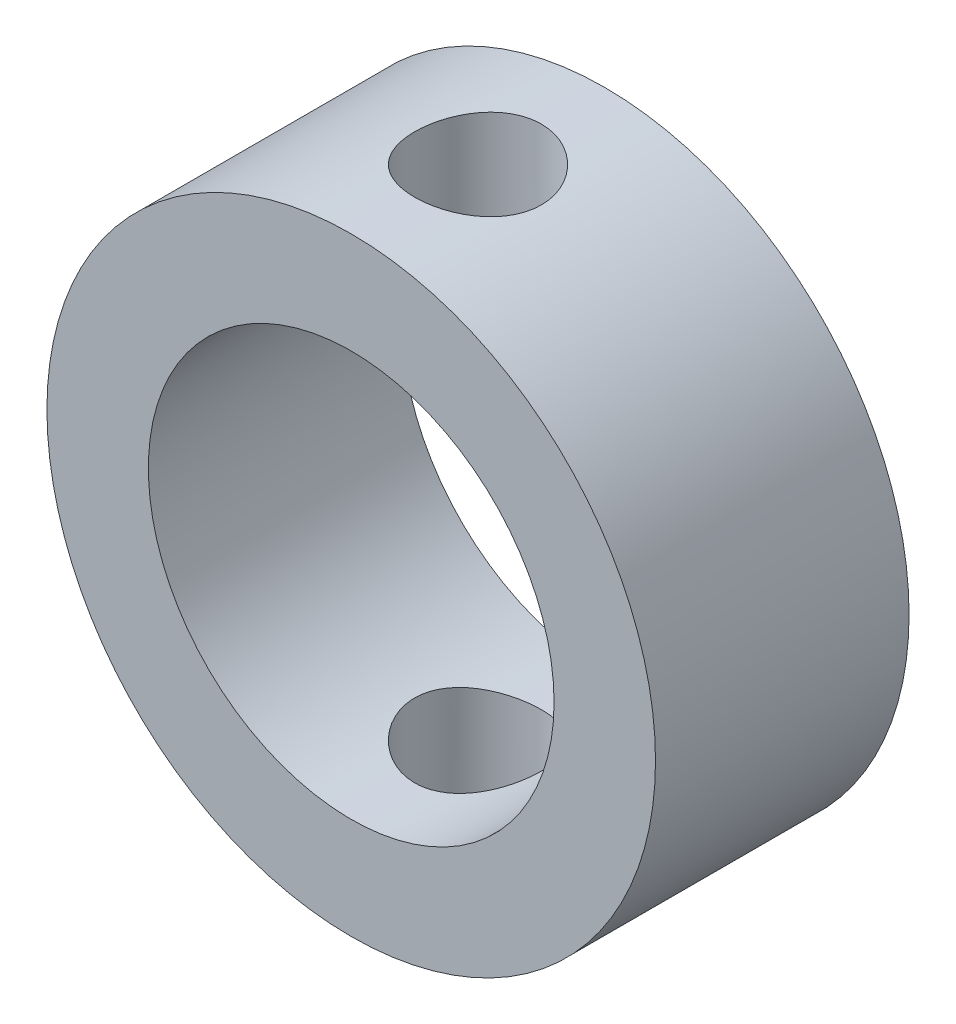
ISO-10303-21;
HEADER;
FILE_DESCRIPTION(('STEP AP214'),'2;1');
FILE_NAME('part.step','',(''),(''),'','','');
FILE_SCHEMA(('AUTOMOTIVE_DESIGN { 1 0 10303 214 1 1 1 1 }'));
ENDSEC;
DATA;
#1=APPLICATION_CONTEXT('core data for automotive mechanical design processes');
#2=APPLICATION_PROTOCOL_DEFINITION('international standard','automotive_design',2000,#1);
#3=PRODUCT_CONTEXT('',#1,'mechanical');
#4=PRODUCT('Part','Part','',(#3));
#5=PRODUCT_RELATED_PRODUCT_CATEGORY('part','',(#4));
#6=PRODUCT_DEFINITION_FORMATION('','',#4);
#7=PRODUCT_DEFINITION_CONTEXT('part definition',#1,'design');
#8=PRODUCT_DEFINITION('design','',#6,#7);
#9=PRODUCT_DEFINITION_SHAPE('','',#8);
#10=(LENGTH_UNIT() NAMED_UNIT(*) SI_UNIT(.MILLI.,.METRE.));
#11=(NAMED_UNIT(*) PLANE_ANGLE_UNIT() SI_UNIT($,.RADIAN.));
#12=(NAMED_UNIT(*) SI_UNIT($,.STERADIAN.) SOLID_ANGLE_UNIT());
#13=UNCERTAINTY_MEASURE_WITH_UNIT(LENGTH_MEASURE(1.E-05),#10,'distance_accuracy_value','');
#14=(GEOMETRIC_REPRESENTATION_CONTEXT(3) GLOBAL_UNCERTAINTY_ASSIGNED_CONTEXT((#13)) GLOBAL_UNIT_ASSIGNED_CONTEXT((#10,
#11,#12)) REPRESENTATION_CONTEXT('',''));
#15=CARTESIAN_POINT('',(0.,0.,0.));
#16=DIRECTION('',(0.,0.,1.));
#17=DIRECTION('',(1.,0.,0.));
#18=AXIS2_PLACEMENT_3D('',#15,#16,#17);
#19=CARTESIAN_POINT('',(0.,0.,5.));
#20=DIRECTION('',(0.,0.,-1.));
#21=DIRECTION('',(-1.,0.,0.));
#22=AXIS2_PLACEMENT_3D('',#19,#20,#21);
#23=CYLINDRICAL_SURFACE('',#22,6.);
#24=CARTESIAN_POINT('',(0.,-6.,3.75));
#25=CARTESIAN_POINT('',(-0.0694090417016604,-5.99999871526651,3.74999752253078));
#26=CARTESIAN_POINT('',(-0.138848789520875,-5.99878328775043,3.74419933428125));
#27=CARTESIAN_POINT('',(-0.275761316266993,-5.9940520099068,3.72118065046715));
#28=CARTESIAN_POINT('',(-0.343232560128313,-5.99053441189248,3.70395147696307));
#29=CARTESIAN_POINT('',(-0.474209132291342,-5.98159109196202,3.65862954507818));
#30=CARTESIAN_POINT('',(-0.537718336709185,-5.97616727052645,3.63054760400111));
#31=CARTESIAN_POINT('',(-0.659120328605959,-5.96399927809859,3.56435039114382));
#32=CARTESIAN_POINT('',(-0.717013367534327,-5.95725516625975,3.52623556884417));
#33=CARTESIAN_POINT('',(-0.826390324308837,-5.9430770002465,3.44046365980936));
#34=CARTESIAN_POINT('',(-0.877780244162686,-5.93563505848531,3.39268799876492));
#35=CARTESIAN_POINT('',(-0.971877776769393,-5.92095657692448,3.28920534080489));
#36=CARTESIAN_POINT('',(-1.01458467096099,-5.91372005416683,3.23349768812774));
#37=CARTESIAN_POINT('',(-1.09051031677217,-5.90019442595308,3.11504803123384));
#38=CARTESIAN_POINT('',(-1.12363054680651,-5.89391545174828,3.05224161549726));
#39=CARTESIAN_POINT('',(-1.17881119348064,-5.8831284065002,2.92180254822724));
#40=CARTESIAN_POINT('',(-1.20087280167641,-5.87862014467568,2.85417041755746));
#41=CARTESIAN_POINT('',(-1.23300240133737,-5.87196500986122,2.71701476258436));
#42=CARTESIAN_POINT('',(-1.24323597696799,-5.86978556855865,2.64753164066523));
#43=CARTESIAN_POINT('',(-1.25193357655615,-5.86793690716491,2.50780315713737));
#44=CARTESIAN_POINT('',(-1.25039890894687,-5.86826740800981,2.4375578811347));
#45=CARTESIAN_POINT('',(-1.23573719037197,-5.87137174319175,2.29951897202482));
#46=CARTESIAN_POINT('',(-1.2228010523272,-5.87410533679901,2.23170402033879));
#47=CARTESIAN_POINT('',(-1.18600543529945,-5.88164437615942,2.09922849035507));
#48=CARTESIAN_POINT('',(-1.16214539481382,-5.88644992841317,2.03456807439367));
#49=CARTESIAN_POINT('',(-1.10400003213928,-5.89763191464102,1.90969277158402));
#50=CARTESIAN_POINT('',(-1.06964002534237,-5.90401953785586,1.84951370347293));
#51=CARTESIAN_POINT('',(-0.991522699274818,-5.91763890010721,1.73570425573184));
#52=CARTESIAN_POINT('',(-0.947764212262588,-5.92487074398537,1.68207469116402));
#53=CARTESIAN_POINT('',(-0.851074921546783,-5.93953730929909,1.58178603891963));
#54=CARTESIAN_POINT('',(-0.797981433412083,-5.94697323199473,1.53528383110299));
#55=CARTESIAN_POINT('',(-0.684667288611798,-5.96108088143001,1.45181955777103));
#56=CARTESIAN_POINT('',(-0.624446525025766,-5.96775259670236,1.4148576354016));
#57=CARTESIAN_POINT('',(-0.498405541235478,-5.97959870942815,1.35148991846405));
#58=CARTESIAN_POINT('',(-0.4325754619265,-5.98477039710258,1.32510319543288));
#59=CARTESIAN_POINT('',(-0.297284620972155,-5.99301338211281,1.28380829516451));
#60=CARTESIAN_POINT('',(-0.227824338595089,-5.99608495596053,1.2688986067686));
#61=CARTESIAN_POINT('',(-0.0885918657008345,-5.99974275215456,1.25120574793211));
#62=CARTESIAN_POINT('',(-0.0188480555261778,-6.00037293537579,1.24820805850575));
#63=CARTESIAN_POINT('',(0.120143798757715,-5.99919952252774,1.2538449499691));
#64=CARTESIAN_POINT('',(0.189391872962259,-5.99739607548153,1.2624788186016));
#65=CARTESIAN_POINT('',(0.324726367119814,-5.99158564979184,1.29095565346953));
#66=CARTESIAN_POINT('',(0.390837192894207,-5.98760052868077,1.31068748538347));
#67=CARTESIAN_POINT('',(0.518811446661332,-5.97787227242395,1.36067786042141));
#68=CARTESIAN_POINT('',(0.580674536336776,-5.97212899744579,1.39093724086598));
#69=CARTESIAN_POINT('',(0.699294306943495,-5.95941241490714,1.46158037823756));
#70=CARTESIAN_POINT('',(0.755973219469835,-5.9524239381233,1.50209192956906));
#71=CARTESIAN_POINT('',(0.861805445886521,-5.93802568299709,1.59191956307627));
#72=CARTESIAN_POINT('',(0.910957877913287,-5.93061585542511,1.64123667551894));
#73=CARTESIAN_POINT('',(1.0011786486518,-5.91606024531377,1.7482555769997));
#74=CARTESIAN_POINT('',(1.04209914600205,-5.90892089307501,1.80608303195528));
#75=CARTESIAN_POINT('',(1.11364719079244,-5.89585601015805,1.92791628421379));
#76=CARTESIAN_POINT('',(1.14427516677864,-5.88993042894651,1.9919218241391));
#77=CARTESIAN_POINT('',(1.19417246443922,-5.88001700708041,2.12396119629823));
#78=CARTESIAN_POINT('',(1.21350309828032,-5.87601872784687,2.19197103716584));
#79=CARTESIAN_POINT('',(1.24044038523407,-5.87039184709697,2.33036655049226));
#80=CARTESIAN_POINT('',(1.24804871544441,-5.86876290660367,2.40075188161944));
#81=CARTESIAN_POINT('',(1.25125926487611,-5.86807907308506,2.54041340099965));
#82=CARTESIAN_POINT('',(1.24709542622726,-5.86897402321502,2.60968407022205));
#83=CARTESIAN_POINT('',(1.22739905314032,-5.87312447254927,2.74651400892022));
#84=CARTESIAN_POINT('',(1.21186662782266,-5.87637994909626,2.81407329481611));
#85=CARTESIAN_POINT('',(1.16998217768585,-5.88486132447716,2.94539777189066));
#86=CARTESIAN_POINT('',(1.14366117568421,-5.8900815700793,3.00917324648693));
#87=CARTESIAN_POINT('',(1.08097457299757,-5.90190705738738,3.13143877602667));
#88=CARTESIAN_POINT('',(1.0446080398303,-5.9085124276546,3.18992833963313));
#89=CARTESIAN_POINT('',(0.962073695342411,-5.92251579551146,3.30112162707945));
#90=CARTESIAN_POINT('',(0.915737890418226,-5.92992613868404,3.35369912456499));
#91=CARTESIAN_POINT('',(0.814924438115334,-5.94461839583213,3.45040949322636));
#92=CARTESIAN_POINT('',(0.760444918832968,-5.9519002798488,3.49454041755149));
#93=CARTESIAN_POINT('',(0.644134427507703,-5.96561444547638,3.57358857318406));
#94=CARTESIAN_POINT('',(0.582225921521348,-5.97203596073244,3.60839367988629));
#95=CARTESIAN_POINT('',(0.453319843998454,-5.98319908494092,3.66705022843002));
#96=CARTESIAN_POINT('',(0.386326781907244,-5.98794216182101,3.69091124718188));
#97=CARTESIAN_POINT('',(0.266015292900105,-5.99432499781444,3.72254027828842));
#98=CARTESIAN_POINT('',(0.213367593727929,-5.99644035661395,3.73281876320886));
#99=CARTESIAN_POINT('',(0.107152674176537,-5.99927832789758,3.74654945427733));
#100=CARTESIAN_POINT('',(0.053585487848872,-6.00000099184586,3.75000191266719));
#101=CARTESIAN_POINT('',(0.,-6.,3.75));
#102=B_SPLINE_CURVE_WITH_KNOTS('',3,(#24,#25,#26,#27,#28,#29,#30,#31,#32,#33,#34,#35,#36,#37,
#38,#39,#40,#41,#42,#43,#44,#45,#46,#47,#48,#49,#50,#51,#52,#53,#54,#55,#56,#57,#58,#59,#60,#61,
#62,#63,#64,#65,#66,#67,#68,#69,#70,#71,#72,#73,#74,#75,#76,#77,#78,#79,#80,#81,#82,#83,#84,#85,
#86,#87,#88,#89,#90,#91,#92,#93,#94,#95,#96,#97,#98,#99,#100,#101),.UNSPECIFIED.,.T.,.F.,(4,2,2,
2,2,2,2,2,2,2,2,2,2,2,2,2,2,2,2,2,2,2,2,2,2,2,2,2,2,2,2,2,2,2,2,2,2,2,4),(0.,0.208031045103183,
0.416220199906225,0.624202378825443,0.83217524157299,1.04287526388123,1.25359271551786,
1.46640449178549,1.6791933328549,1.88896575169855,2.09871484767165,2.3050171212906,
2.5113300003028,2.71914592416749,2.92698768368035,3.13889526355466,3.35080602278218,
3.56309724499663,3.77536051045772,3.98378339407676,4.19219351552278,4.39855286632622,
4.60492863390934,4.81401583995737,5.02312752564574,5.23571263829337,5.4482888985131,
5.65970050095026,5.87108185414185,6.07829223291039,6.28550062281362,6.49211731393256,
6.69875319081481,6.9091902483031,7.1196757511737,7.33258864398257,7.54531486464974,
7.70592588477281,7.86653096973392),.UNSPECIFIED.);
#103=CARTESIAN_POINT('',(0.,-6.,3.75));
#104=VERTEX_POINT('',#103);
#105=EDGE_CURVE('E51',#104,#104,#102,.T.);
#106=ORIENTED_EDGE('',*,*,#105,.F.);
#107=EDGE_LOOP('',(#106));
#108=FACE_BOUND('',#107,.T.);
#109=CARTESIAN_POINT('',(0.,0.,5.));
#110=DIRECTION('',(0.,0.,1.));
#111=DIRECTION('',(1.,0.,0.));
#112=AXIS2_PLACEMENT_3D('',#109,#110,#111);
#113=CIRCLE('',#112,6.);
#114=CARTESIAN_POINT('',(6.,0.,5.));
#115=VERTEX_POINT('',#114);
#116=EDGE_CURVE('E10',#115,#115,#113,.T.);
#117=ORIENTED_EDGE('',*,*,#116,.F.);
#118=EDGE_LOOP('',(#117));
#119=FACE_BOUND('',#118,.T.);
#120=CARTESIAN_POINT('',(0.,0.,0.));
#121=DIRECTION('',(0.,0.,1.));
#122=DIRECTION('',(1.,0.,0.));
#123=AXIS2_PLACEMENT_3D('',#120,#121,#122);
#124=CIRCLE('',#123,6.);
#125=CARTESIAN_POINT('',(6.,0.,0.));
#126=VERTEX_POINT('',#125);
#127=EDGE_CURVE('E36',#126,#126,#124,.T.);
#128=ORIENTED_EDGE('',*,*,#127,.T.);
#129=EDGE_LOOP('',(#128));
#130=FACE_BOUND('',#129,.T.);
#131=CARTESIAN_POINT('',(0.,6.,1.25));
#132=CARTESIAN_POINT('',(0.069409041701661,5.99999871526651,1.25000247746922));
#133=CARTESIAN_POINT('',(0.138848789520876,5.99878328775043,1.25580066571875));
#134=CARTESIAN_POINT('',(0.275761316266994,5.9940520099068,1.27881934953285));
#135=CARTESIAN_POINT('',(0.343232560128313,5.99053441189248,1.29604852303693));
#136=CARTESIAN_POINT('',(0.474209132291343,5.98159109196202,1.34137045492182));
#137=CARTESIAN_POINT('',(0.537718336709186,5.97616727052645,1.36945239599888));
#138=CARTESIAN_POINT('',(0.659120328605959,5.96399927809859,1.43564960885618));
#139=CARTESIAN_POINT('',(0.717013367534328,5.95725516625975,1.47376443115583));
#140=CARTESIAN_POINT('',(0.826390324308838,5.9430770002465,1.55953634019064));
#141=CARTESIAN_POINT('',(0.877780244162686,5.93563505848531,1.60731200123508));
#142=CARTESIAN_POINT('',(0.971877776769393,5.92095657692448,1.71079465919511));
#143=CARTESIAN_POINT('',(1.01458467096099,5.91372005416683,1.76650231187226));
#144=CARTESIAN_POINT('',(1.09051031677217,5.90019442595308,1.88495196876616));
#145=CARTESIAN_POINT('',(1.12363054680651,5.89391545174828,1.94775838450274));
#146=CARTESIAN_POINT('',(1.17881119348064,5.8831284065002,2.07819745177275));
#147=CARTESIAN_POINT('',(1.20087280167641,5.87862014467568,2.14582958244254));
#148=CARTESIAN_POINT('',(1.23300240133737,5.87196500986122,2.28298523741564));
#149=CARTESIAN_POINT('',(1.24323597696799,5.86978556855865,2.35246835933477));
#150=CARTESIAN_POINT('',(1.25193357655615,5.86793690716491,2.49219684286263));
#151=CARTESIAN_POINT('',(1.25039890894687,5.86826740800981,2.5624421188653));
#152=CARTESIAN_POINT('',(1.23573719037197,5.87137174319175,2.70048102797518));
#153=CARTESIAN_POINT('',(1.2228010523272,5.87410533679901,2.76829597966121));
#154=CARTESIAN_POINT('',(1.18600543529945,5.88164437615942,2.90077150964493));
#155=CARTESIAN_POINT('',(1.16214539481382,5.88644992841317,2.96543192560633));
#156=CARTESIAN_POINT('',(1.10400003213928,5.89763191464102,3.09030722841598));
#157=CARTESIAN_POINT('',(1.06964002534237,5.90401953785586,3.15048629652707));
#158=CARTESIAN_POINT('',(0.991522699274819,5.91763890010721,3.26429574426816));
#159=CARTESIAN_POINT('',(0.947764212262589,5.92487074398537,3.31792530883598));
#160=CARTESIAN_POINT('',(0.851074921546784,5.93953730929909,3.41821396108037));
#161=CARTESIAN_POINT('',(0.797981433412084,5.94697323199473,3.46471616889701));
#162=CARTESIAN_POINT('',(0.684667288611799,5.96108088143001,3.54818044222897));
#163=CARTESIAN_POINT('',(0.624446525025766,5.96775259670236,3.5851423645984));
#164=CARTESIAN_POINT('',(0.498405541235479,5.97959870942815,3.64851008153595));
#165=CARTESIAN_POINT('',(0.432575461926501,5.98477039710258,3.67489680456712));
#166=CARTESIAN_POINT('',(0.297284620972156,5.99301338211281,3.71619170483549));
#167=CARTESIAN_POINT('',(0.22782433859509,5.99608495596053,3.7311013932314));
#168=CARTESIAN_POINT('',(0.0885918657008356,5.99974275215456,3.74879425206789));
#169=CARTESIAN_POINT('',(0.0188480555261789,6.00037293537579,3.75179194149425));
#170=CARTESIAN_POINT('',(-0.120143798757714,5.99919952252774,3.7461550500309));
#171=CARTESIAN_POINT('',(-0.189391872962258,5.99739607548153,3.7375211813984));
#172=CARTESIAN_POINT('',(-0.324726367119813,5.99158564979184,3.70904434653047));
#173=CARTESIAN_POINT('',(-0.390837192894205,5.98760052868077,3.68931251461653));
#174=CARTESIAN_POINT('',(-0.518811446661331,5.97787227242395,3.63932213957859));
#175=CARTESIAN_POINT('',(-0.580674536336775,5.97212899744579,3.60906275913402));
#176=CARTESIAN_POINT('',(-0.699294306943494,5.95941241490714,3.53841962176244));
#177=CARTESIAN_POINT('',(-0.755973219469834,5.9524239381233,3.49790807043094));
#178=CARTESIAN_POINT('',(-0.86180544588652,5.93802568299709,3.40808043692373));
#179=CARTESIAN_POINT('',(-0.910957877913286,5.93061585542511,3.35876332448106));
#180=CARTESIAN_POINT('',(-1.0011786486518,5.91606024531377,3.2517444230003));
#181=CARTESIAN_POINT('',(-1.04209914600204,5.90892089307501,3.19391696804472));
#182=CARTESIAN_POINT('',(-1.11364719079243,5.89585601015805,3.07208371578621));
#183=CARTESIAN_POINT('',(-1.14427516677864,5.88993042894651,3.00807817586089));
#184=CARTESIAN_POINT('',(-1.19417246443922,5.88001700708041,2.87603880370177));
#185=CARTESIAN_POINT('',(-1.21350309828032,5.87601872784687,2.80802896283416));
#186=CARTESIAN_POINT('',(-1.24044038523407,5.87039184709697,2.66963344950774));
#187=CARTESIAN_POINT('',(-1.24804871544441,5.86876290660367,2.59924811838056));
#188=CARTESIAN_POINT('',(-1.25125926487611,5.86807907308506,2.45958659900035));
#189=CARTESIAN_POINT('',(-1.24709542622725,5.86897402321502,2.39031592977794));
#190=CARTESIAN_POINT('',(-1.22739905314032,5.87312447254927,2.25348599107978));
#191=CARTESIAN_POINT('',(-1.21186662782266,5.87637994909626,2.18592670518389));
#192=CARTESIAN_POINT('',(-1.16998217768585,5.88486132447716,2.05460222810934));
#193=CARTESIAN_POINT('',(-1.14366117568421,5.8900815700793,1.99082675351307));
#194=CARTESIAN_POINT('',(-1.08097457299757,5.90190705738738,1.86856122397333));
#195=CARTESIAN_POINT('',(-1.0446080398303,5.9085124276546,1.81007166036687));
#196=CARTESIAN_POINT('',(-0.962073695342411,5.92251579551146,1.69887837292055));
#197=CARTESIAN_POINT('',(-0.915737890418226,5.92992613868404,1.64630087543501));
#198=CARTESIAN_POINT('',(-0.814924438115335,5.94461839583213,1.54959050677364));
#199=CARTESIAN_POINT('',(-0.760444918832968,5.9519002798488,1.50545958244851));
#200=CARTESIAN_POINT('',(-0.644134427507703,5.96561444547638,1.42641142681594));
#201=CARTESIAN_POINT('',(-0.582225921521348,5.97203596073244,1.39160632011371));
#202=CARTESIAN_POINT('',(-0.453319843998454,5.98319908494092,1.33294977156998));
#203=CARTESIAN_POINT('',(-0.386326781907244,5.98794216182101,1.30908875281812));
#204=CARTESIAN_POINT('',(-0.266015292900106,5.99432499781444,1.27745972171157));
#205=CARTESIAN_POINT('',(-0.213367593727929,5.99644035661395,1.26718123679114));
#206=CARTESIAN_POINT('',(-0.107152674176537,5.99927832789758,1.25345054572267));
#207=CARTESIAN_POINT('',(-0.0535854878488718,6.00000099184586,1.24999808733281));
#208=CARTESIAN_POINT('',(0.,6.,1.25));
#209=B_SPLINE_CURVE_WITH_KNOTS('',3,(#131,#132,#133,#134,#135,#136,#137,#138,#139,#140,#141,
#142,#143,#144,#145,#146,#147,#148,#149,#150,#151,#152,#153,#154,#155,#156,#157,#158,#159,#160,
#161,#162,#163,#164,#165,#166,#167,#168,#169,#170,#171,#172,#173,#174,#175,#176,#177,#178,#179,
#180,#181,#182,#183,#184,#185,#186,#187,#188,#189,#190,#191,#192,#193,#194,#195,#196,#197,#198,
#199,#200,#201,#202,#203,#204,#205,#206,#207,#208),.UNSPECIFIED.,.T.,.F.,(4,2,2,2,2,2,2,2,2,2,2,
2,2,2,2,2,2,2,2,2,2,2,2,2,2,2,2,2,2,2,2,2,2,2,2,2,2,2,4),(0.,0.208031045103184,
0.416220199906225,0.624202378825443,0.83217524157299,1.04287526388123,1.25359271551786,
1.46640449178549,1.6791933328549,1.88896575169854,2.09871484767165,2.3050171212906,
2.5113300003028,2.71914592416749,2.92698768368035,3.13889526355466,3.35080602278218,
3.56309724499663,3.77536051045772,3.98378339407676,4.19219351552278,4.39855286632622,
4.60492863390933,4.81401583995737,5.02312752564574,5.23571263829337,5.44828889851309,
5.65970050095025,5.87108185414185,6.07829223291039,6.28550062281362,6.49211731393256,
6.69875319081481,6.9091902483031,7.1196757511737,7.33258864398257,7.54531486464974,
7.70592588477281,7.86653096973392),.UNSPECIFIED.);
#210=CARTESIAN_POINT('',(0.,6.,1.25));
#211=VERTEX_POINT('',#210);
#212=EDGE_CURVE('E59',#211,#211,#209,.T.);
#213=ORIENTED_EDGE('',*,*,#212,.T.);
#214=EDGE_LOOP('',(#213));
#215=FACE_BOUND('',#214,.T.);
#216=ADVANCED_FACE('F33',(#108,#119,#130,#215),#23,.T.);
#217=CARTESIAN_POINT('',(0.,0.,5.));
#218=DIRECTION('',(0.,0.,-1.));
#219=DIRECTION('',(-1.,0.,0.));
#220=AXIS2_PLACEMENT_3D('',#217,#218,#219);
#221=CYLINDRICAL_SURFACE('',#220,4.);
#222=CARTESIAN_POINT('',(0.,0.,0.));
#223=DIRECTION('',(0.,0.,1.));
#224=DIRECTION('',(1.,0.,0.));
#225=AXIS2_PLACEMENT_3D('',#222,#223,#224);
#226=CIRCLE('',#225,4.);
#227=CARTESIAN_POINT('',(4.,0.,0.));
#228=VERTEX_POINT('',#227);
#229=EDGE_CURVE('E45',#228,#228,#226,.T.);
#230=ORIENTED_EDGE('',*,*,#229,.F.);
#231=EDGE_LOOP('',(#230));
#232=FACE_BOUND('',#231,.T.);
#233=CARTESIAN_POINT('',(0.,0.,5.));
#234=DIRECTION('',(0.,0.,1.));
#235=DIRECTION('',(1.,0.,0.));
#236=AXIS2_PLACEMENT_3D('',#233,#234,#235);
#237=CIRCLE('',#236,4.);
#238=CARTESIAN_POINT('',(4.,0.,5.));
#239=VERTEX_POINT('',#238);
#240=EDGE_CURVE('E43',#239,#239,#237,.T.);
#241=ORIENTED_EDGE('',*,*,#240,.T.);
#242=EDGE_LOOP('',(#241));
#243=FACE_BOUND('',#242,.T.);
#244=CARTESIAN_POINT('',(0.,-4.,3.75));
#245=CARTESIAN_POINT('',(-0.0684391851745462,-3.99999965877989,3.74999955341242));
#246=CARTESIAN_POINT('',(-0.136883052502859,-3.99822694984841,3.74436077305555));
#247=CARTESIAN_POINT('',(-0.271769209588448,-3.99132894088807,3.72201375846076));
#248=CARTESIAN_POINT('',(-0.338211042725907,-3.9862028819986,3.70530301863564));
#249=CARTESIAN_POINT('',(-0.467128543650806,-3.97315815697909,3.66143062880426));
#250=CARTESIAN_POINT('',(-0.529610176985804,-3.96524381499025,3.63428515534703));
#251=CARTESIAN_POINT('',(-0.64913480234646,-3.94743969161093,3.57038268232167));
#252=CARTESIAN_POINT('',(-0.706176935444885,-3.93754959899905,3.53362416821941));
#253=CARTESIAN_POINT('',(-0.814965334952281,-3.91650213740282,3.45034400798264));
#254=CARTESIAN_POINT('',(-0.86652002815666,-3.90531715926989,3.40357911493893));
#255=CARTESIAN_POINT('',(-0.961197382036994,-3.88310046374208,3.30213160758645));
#256=CARTESIAN_POINT('',(-1.0043184728987,-3.87206877523457,3.24744752250545));
#257=CARTESIAN_POINT('',(-1.08194336483114,-3.85111144698172,3.13005543619192));
#258=CARTESIAN_POINT('',(-1.11620784150129,-3.84121988301796,3.06718252247278));
#259=CARTESIAN_POINT('',(-1.17359741076672,-3.82407801799234,2.93620768501813));
#260=CARTESIAN_POINT('',(-1.19672543771945,-3.81682702128689,2.86810714420607));
#261=CARTESIAN_POINT('',(-1.23048459930033,-3.80607606984501,2.73077192254794));
#262=CARTESIAN_POINT('',(-1.24147110007865,-3.80246972929508,2.66163315636115));
#263=CARTESIAN_POINT('',(-1.25174555036988,-3.7991005514095,2.52240688108811));
#264=CARTESIAN_POINT('',(-1.25103660995772,-3.79933669227334,2.45231962917834));
#265=CARTESIAN_POINT('',(-1.23821824732739,-3.80353189075438,2.31612553973101));
#266=CARTESIAN_POINT('',(-1.22656057869383,-3.80734341745949,2.24997087413843));
#267=CARTESIAN_POINT('',(-1.19290813355626,-3.81802025652489,2.12060784346265));
#268=CARTESIAN_POINT('',(-1.17091225844551,-3.82488589343115,2.0573997922912));
#269=CARTESIAN_POINT('',(-1.11688874681277,-3.84101044014297,1.93464805556736));
#270=CARTESIAN_POINT('',(-1.08471925662082,-3.85030284660824,1.87517138930802));
#271=CARTESIAN_POINT('',(-1.01136020737848,-3.8702185658007,1.76231223212088));
#272=CARTESIAN_POINT('',(-0.970168305215773,-3.88084222394551,1.70893132974629));
#273=CARTESIAN_POINT('',(-0.877716954182124,-3.90281527800493,1.60722505658301));
#274=CARTESIAN_POINT('',(-0.826084570592818,-3.91417569605696,1.55924044222032));
#275=CARTESIAN_POINT('',(-0.715364408095531,-3.9359157075958,1.47252810642032));
#276=CARTESIAN_POINT('',(-0.65627607734902,-3.94629522838372,1.43380107078079));
#277=CARTESIAN_POINT('',(-0.531664610465454,-3.96501294890191,1.36647231139872));
#278=CARTESIAN_POINT('',(-0.466094906919279,-3.97333460648208,1.33795186453603));
#279=CARTESIAN_POINT('',(-0.330767977782644,-3.98687955828554,1.29244699914843));
#280=CARTESIAN_POINT('',(-0.261012030724608,-3.99210379325151,1.2754590777616));
#281=CARTESIAN_POINT('',(-0.122185157290344,-3.99871389395014,1.25408195742102));
#282=CARTESIAN_POINT('',(-0.0531918487888414,-4.00024022895439,1.24923145640648));
#283=CARTESIAN_POINT('',(0.0846303057325856,-3.99969799730981,1.25096622663733));
#284=CARTESIAN_POINT('',(0.153459174306506,-3.99762995581125,1.2575498273226));
#285=CARTESIAN_POINT('',(0.287219332975852,-3.99022363769772,1.28159559260639));
#286=CARTESIAN_POINT('',(0.352204978420948,-3.98496793110725,1.29878326761251));
#287=CARTESIAN_POINT('',(0.478351928861366,-3.97180121379252,1.34321435236669));
#288=CARTESIAN_POINT('',(0.539512760449016,-3.96388987514204,1.37045900402491));
#289=CARTESIAN_POINT('',(0.657932406672232,-3.94598542759568,1.43497321654879));
#290=CARTESIAN_POINT('',(0.715059739787955,-3.9359462681821,1.47247098749722));
#291=CARTESIAN_POINT('',(0.822365850960096,-3.91493410002887,1.55615321011702));
#292=CARTESIAN_POINT('',(0.872542738043337,-3.90396083845862,1.60234001774311));
#293=CARTESIAN_POINT('',(0.966587462919658,-3.88176994885247,1.70425889005369));
#294=CARTESIAN_POINT('',(1.01012652339774,-3.87055986714446,1.76029666374526));
#295=CARTESIAN_POINT('',(1.08721250244909,-3.84961947087602,1.87912661637074));
#296=CARTESIAN_POINT('',(1.12075957972524,-3.839889132814,1.94191868800443));
#297=CARTESIAN_POINT('',(1.17670083481141,-3.82311782360754,2.07234517288586));
#298=CARTESIAN_POINT('',(1.19913819558886,-3.81606646468027,2.1399596495047));
#299=CARTESIAN_POINT('',(1.23222894320964,-3.80551170941212,2.2782724933238));
#300=CARTESIAN_POINT('',(1.2428868141461,-3.80200696302675,2.34896967637131));
#301=CARTESIAN_POINT('',(1.2517940615754,-3.79908292712494,2.48800408755424));
#302=CARTESIAN_POINT('',(1.25058279621957,-3.79948604683077,2.55630345381293));
#303=CARTESIAN_POINT('',(1.23708818129474,-3.80390090472383,2.69167458491918));
#304=CARTESIAN_POINT('',(1.22480534822559,-3.80791247457319,2.758746406884));
#305=CARTESIAN_POINT('',(1.18987729913378,-3.81896814158112,2.88879403960178));
#306=CARTESIAN_POINT('',(1.16738642405944,-3.82596698183474,2.95181544109601));
#307=CARTESIAN_POINT('',(1.11280227335064,-3.84219704261348,3.07324041353135));
#308=CARTESIAN_POINT('',(1.08070704444254,-3.85142871716522,3.13164304207768));
#309=CARTESIAN_POINT('',(1.00635675013475,-3.8715348703158,3.24464597044057));
#310=CARTESIAN_POINT('',(0.963753335241274,-3.88245948922441,3.29900812950044));
#311=CARTESIAN_POINT('',(0.870208996404848,-3.90448998821726,3.3999863281118));
#312=CARTESIAN_POINT('',(0.819265842344403,-3.91559591606795,3.44660028899101));
#313=CARTESIAN_POINT('',(0.708486662823333,-3.93717271952329,3.53228253836299));
#314=CARTESIAN_POINT('',(0.64841457448738,-3.94761101730634,3.57105473644997));
#315=CARTESIAN_POINT('',(0.522279138013654,-3.96626769296916,3.63789891513944));
#316=CARTESIAN_POINT('',(0.456218157795449,-3.97448694315832,3.66597510214183));
#317=CARTESIAN_POINT('',(0.325747635373978,-3.98720650733461,3.70859136760847));
#318=CARTESIAN_POINT('',(0.261670337112546,-3.99196240806139,3.72407486730534));
#319=CARTESIAN_POINT('',(0.131729895440248,-3.99835900340486,3.74477835996771));
#320=CARTESIAN_POINT('',(0.0658671161396751,-4.00000032839644,3.750000429804));
#321=CARTESIAN_POINT('',(0.,-4.,3.75));
#322=B_SPLINE_CURVE_WITH_KNOTS('',3,(#244,#245,#246,#247,#248,#249,#250,#251,#252,#253,#254,
#255,#256,#257,#258,#259,#260,#261,#262,#263,#264,#265,#266,#267,#268,#269,#270,#271,#272,#273,
#274,#275,#276,#277,#278,#279,#280,#281,#282,#283,#284,#285,#286,#287,#288,#289,#290,#291,#292,
#293,#294,#295,#296,#297,#298,#299,#300,#301,#302,#303,#304,#305,#306,#307,#308,#309,#310,#311,
#312,#313,#314,#315,#316,#317,#318,#319,#320,#321),.UNSPECIFIED.,.T.,.F.,(4,2,2,2,2,2,2,2,2,2,2,
2,2,2,2,2,2,2,2,2,2,2,2,2,2,2,2,2,2,2,2,2,2,2,2,2,2,2,4),(0.,0.20507544943251,0.410197323349067,
0.615002479202437,0.819839921558391,1.03037822195158,1.24095567431276,1.45673771247494,
1.67246286279527,1.8816915016721,2.09086450295138,2.29176917422169,2.49269519979063,
2.69655642720545,2.90047066010359,3.113667472796,3.32688007413303,3.5417546068977,
3.75656384494554,3.96307568548238,4.16955735649363,4.37090626722872,4.572280050345,
4.77856324738343,4.98490245709259,5.1994177871314,5.41392970983712,5.62760115751032,
5.84119123892431,6.04512203476054,6.24904331751085,6.44997913396672,6.65095584330174,
6.85979514006362,7.06869037373341,7.28440668126413,7.50003806666338,7.69744636651541,
7.89481470763048),.UNSPECIFIED.);
#323=CARTESIAN_POINT('',(0.,-4.,3.75));
#324=VERTEX_POINT('',#323);
#325=EDGE_CURVE('E60',#324,#324,#322,.T.);
#326=ORIENTED_EDGE('',*,*,#325,.T.);
#327=EDGE_LOOP('',(#326));
#328=FACE_BOUND('',#327,.T.);
#329=CARTESIAN_POINT('',(0.,4.,1.25));
#330=CARTESIAN_POINT('',(0.0684391851745468,3.99999965877989,1.25000044658758));
#331=CARTESIAN_POINT('',(0.13688305250286,3.99822694984841,1.25563922694445));
#332=CARTESIAN_POINT('',(0.271769209588449,3.99132894088807,1.27798624153924));
#333=CARTESIAN_POINT('',(0.338211042725908,3.9862028819986,1.29469698136436));
#334=CARTESIAN_POINT('',(0.467128543650807,3.97315815697909,1.33856937119574));
#335=CARTESIAN_POINT('',(0.529610176985804,3.96524381499025,1.36571484465297));
#336=CARTESIAN_POINT('',(0.64913480234646,3.94743969161093,1.42961731767833));
#337=CARTESIAN_POINT('',(0.706176935444886,3.93754959899905,1.46637583178059));
#338=CARTESIAN_POINT('',(0.814965334952282,3.91650213740282,1.54965599201736));
#339=CARTESIAN_POINT('',(0.866520028156661,3.90531715926989,1.59642088506107));
#340=CARTESIAN_POINT('',(0.961197382036994,3.88310046374208,1.69786839241355));
#341=CARTESIAN_POINT('',(1.0043184728987,3.87206877523457,1.75255247749455));
#342=CARTESIAN_POINT('',(1.08194336483114,3.85111144698172,1.86994456380808));
#343=CARTESIAN_POINT('',(1.11620784150129,3.84121988301796,1.93281747752722));
#344=CARTESIAN_POINT('',(1.17359741076672,3.82407801799234,2.06379231498187));
#345=CARTESIAN_POINT('',(1.19672543771945,3.81682702128689,2.13189285579393));
#346=CARTESIAN_POINT('',(1.23048459930034,3.80607606984501,2.26922807745206));
#347=CARTESIAN_POINT('',(1.24147110007865,3.80246972929508,2.33836684363885));
#348=CARTESIAN_POINT('',(1.25174555036988,3.7991005514095,2.47759311891189));
#349=CARTESIAN_POINT('',(1.25103660995772,3.79933669227334,2.54768037082166));
#350=CARTESIAN_POINT('',(1.23821824732739,3.80353189075438,2.68387446026898));
#351=CARTESIAN_POINT('',(1.22656057869383,3.80734341745949,2.75002912586156));
#352=CARTESIAN_POINT('',(1.19290813355626,3.81802025652489,2.87939215653735));
#353=CARTESIAN_POINT('',(1.17091225844551,3.82488589343115,2.9426002077088));
#354=CARTESIAN_POINT('',(1.11688874681277,3.84101044014297,3.06535194443264));
#355=CARTESIAN_POINT('',(1.08471925662082,3.85030284660824,3.12482861069198));
#356=CARTESIAN_POINT('',(1.01136020737848,3.8702185658007,3.23768776787912));
#357=CARTESIAN_POINT('',(0.970168305215774,3.88084222394551,3.29106867025371));
#358=CARTESIAN_POINT('',(0.877716954182124,3.90281527800493,3.39277494341699));
#359=CARTESIAN_POINT('',(0.826084570592818,3.91417569605696,3.44075955777968));
#360=CARTESIAN_POINT('',(0.715364408095531,3.9359157075958,3.52747189357968));
#361=CARTESIAN_POINT('',(0.656276077349021,3.94629522838372,3.56619892921921));
#362=CARTESIAN_POINT('',(0.531664610465455,3.96501294890191,3.63352768860128));
#363=CARTESIAN_POINT('',(0.46609490691928,3.97333460648208,3.66204813546397));
#364=CARTESIAN_POINT('',(0.330767977782645,3.98687955828554,3.70755300085157));
#365=CARTESIAN_POINT('',(0.261012030724609,3.99210379325151,3.7245409222384));
#366=CARTESIAN_POINT('',(0.122185157290345,3.99871389395014,3.74591804257898));
#367=CARTESIAN_POINT('',(0.0531918487888425,4.00024022895439,3.75076854359352));
#368=CARTESIAN_POINT('',(-0.0846303057325846,3.99969799730981,3.74903377336267));
#369=CARTESIAN_POINT('',(-0.153459174306505,3.99762995581125,3.7424501726774));
#370=CARTESIAN_POINT('',(-0.287219332975852,3.99022363769772,3.71840440739361));
#371=CARTESIAN_POINT('',(-0.352204978420948,3.98496793110725,3.70121673238748));
#372=CARTESIAN_POINT('',(-0.478351928861366,3.97180121379252,3.65678564763331));
#373=CARTESIAN_POINT('',(-0.539512760449016,3.96388987514203,3.62954099597509));
#374=CARTESIAN_POINT('',(-0.657932406672231,3.94598542759568,3.56502678345121));
#375=CARTESIAN_POINT('',(-0.715059739787955,3.9359462681821,3.52752901250278));
#376=CARTESIAN_POINT('',(-0.822365850960096,3.91493410002887,3.44384678988298));
#377=CARTESIAN_POINT('',(-0.872542738043336,3.90396083845862,3.39765998225689));
#378=CARTESIAN_POINT('',(-0.966587462919656,3.88176994885247,3.29574110994631));
#379=CARTESIAN_POINT('',(-1.01012652339774,3.87055986714446,3.23970333625474));
#380=CARTESIAN_POINT('',(-1.08721250244909,3.84961947087602,3.12087338362926));
#381=CARTESIAN_POINT('',(-1.12075957972524,3.839889132814,3.05808131199557));
#382=CARTESIAN_POINT('',(-1.17670083481141,3.82311782360754,2.92765482711414));
#383=CARTESIAN_POINT('',(-1.19913819558886,3.81606646468027,2.8600403504953));
#384=CARTESIAN_POINT('',(-1.23222894320964,3.80551170941212,2.7217275066762));
#385=CARTESIAN_POINT('',(-1.2428868141461,3.80200696302675,2.65103032362869));
#386=CARTESIAN_POINT('',(-1.2517940615754,3.79908292712494,2.51199591244576));
#387=CARTESIAN_POINT('',(-1.25058279621957,3.79948604683077,2.44369654618707));
#388=CARTESIAN_POINT('',(-1.23708818129474,3.80390090472383,2.30832541508082));
#389=CARTESIAN_POINT('',(-1.22480534822559,3.80791247457319,2.241253593116));
#390=CARTESIAN_POINT('',(-1.18987729913378,3.81896814158112,2.11120596039822));
#391=CARTESIAN_POINT('',(-1.16738642405944,3.82596698183474,2.04818455890399));
#392=CARTESIAN_POINT('',(-1.11280227335064,3.84219704261348,1.92675958646865));
#393=CARTESIAN_POINT('',(-1.08070704444254,3.85142871716522,1.86835695792232));
#394=CARTESIAN_POINT('',(-1.00635675013475,3.8715348703158,1.75535402955943));
#395=CARTESIAN_POINT('',(-0.963753335241274,3.88245948922441,1.70099187049956));
#396=CARTESIAN_POINT('',(-0.870208996404848,3.90448998821726,1.6000136718882));
#397=CARTESIAN_POINT('',(-0.819265842344402,3.91559591606795,1.55339971100899));
#398=CARTESIAN_POINT('',(-0.708486662823332,3.93717271952329,1.46771746163701));
#399=CARTESIAN_POINT('',(-0.64841457448738,3.94761101730634,1.42894526355003));
#400=CARTESIAN_POINT('',(-0.522279138013654,3.96626769296916,1.36210108486056));
#401=CARTESIAN_POINT('',(-0.456218157795449,3.97448694315832,1.33402489785817));
#402=CARTESIAN_POINT('',(-0.325747635373977,3.98720650733461,1.29140863239153));
#403=CARTESIAN_POINT('',(-0.261670337112545,3.99196240806139,1.27592513269466));
#404=CARTESIAN_POINT('',(-0.131729895440247,3.99835900340486,1.25522164003228));
#405=CARTESIAN_POINT('',(-0.0658671161396744,4.00000032839644,1.249999570196));
#406=CARTESIAN_POINT('',(0.,4.,1.25));
#407=B_SPLINE_CURVE_WITH_KNOTS('',3,(#329,#330,#331,#332,#333,#334,#335,#336,#337,#338,#339,
#340,#341,#342,#343,#344,#345,#346,#347,#348,#349,#350,#351,#352,#353,#354,#355,#356,#357,#358,
#359,#360,#361,#362,#363,#364,#365,#366,#367,#368,#369,#370,#371,#372,#373,#374,#375,#376,#377,
#378,#379,#380,#381,#382,#383,#384,#385,#386,#387,#388,#389,#390,#391,#392,#393,#394,#395,#396,
#397,#398,#399,#400,#401,#402,#403,#404,#405,#406),.UNSPECIFIED.,.T.,.F.,(4,2,2,2,2,2,2,2,2,2,2,
2,2,2,2,2,2,2,2,2,2,2,2,2,2,2,2,2,2,2,2,2,2,2,2,2,2,2,4),(0.,0.20507544943251,0.410197323349067,
0.615002479202437,0.819839921558392,1.03037822195158,1.24095567431276,1.45673771247494,
1.67246286279527,1.8816915016721,2.09086450295138,2.29176917422169,2.49269519979063,
2.69655642720545,2.90047066010359,3.113667472796,3.32688007413303,3.5417546068977,
3.75656384494554,3.96307568548238,4.16955735649363,4.37090626722872,4.572280050345,
4.77856324738343,4.98490245709259,5.1994177871314,5.41392970983712,5.62760115751032,
5.84119123892431,6.04512203476054,6.24904331751085,6.44997913396672,6.65095584330174,
6.85979514006362,7.06869037373341,7.28440668126413,7.50003806666338,7.69744636651542,
7.89481470763048),.UNSPECIFIED.);
#408=CARTESIAN_POINT('',(0.,4.,1.25));
#409=VERTEX_POINT('',#408);
#410=EDGE_CURVE('E48',#409,#409,#407,.T.);
#411=ORIENTED_EDGE('',*,*,#410,.F.);
#412=EDGE_LOOP('',(#411));
#413=FACE_BOUND('',#412,.T.);
#414=ADVANCED_FACE('F94',(#232,#243,#328,#413),#221,.F.);
#415=CARTESIAN_POINT('',(0.,0.,5.));
#416=DIRECTION('',(0.,0.,1.));
#417=DIRECTION('',(1.,0.,0.));
#418=AXIS2_PLACEMENT_3D('',#415,#416,#417);
#419=PLANE('',#418);
#420=ORIENTED_EDGE('',*,*,#116,.T.);
#421=EDGE_LOOP('',(#420));
#422=FACE_BOUND('',#421,.T.);
#423=ORIENTED_EDGE('',*,*,#240,.F.);
#424=EDGE_LOOP('',(#423));
#425=FACE_BOUND('',#424,.T.);
#426=ADVANCED_FACE('F96',(#422,#425),#419,.T.);
#427=CARTESIAN_POINT('',(0.,0.,0.));
#428=DIRECTION('',(0.,0.,1.));
#429=DIRECTION('',(1.,0.,0.));
#430=AXIS2_PLACEMENT_3D('',#427,#428,#429);
#431=PLANE('',#430);
#432=ORIENTED_EDGE('',*,*,#127,.F.);
#433=EDGE_LOOP('',(#432));
#434=FACE_BOUND('',#433,.T.);
#435=ORIENTED_EDGE('',*,*,#229,.T.);
#436=EDGE_LOOP('',(#435));
#437=FACE_BOUND('',#436,.T.);
#438=ADVANCED_FACE('F102',(#434,#437),#431,.F.);
#439=CARTESIAN_POINT('',(0.,-6.001,2.5));
#440=DIRECTION('',(0.,1.,0.));
#441=DIRECTION('',(0.,0.,1.));
#442=AXIS2_PLACEMENT_3D('',#439,#440,#441);
#443=CYLINDRICAL_SURFACE('',#442,1.25);
#444=ORIENTED_EDGE('',*,*,#325,.F.);
#445=EDGE_LOOP('',(#444));
#446=FACE_BOUND('',#445,.T.);
#447=ORIENTED_EDGE('',*,*,#105,.T.);
#448=EDGE_LOOP('',(#447));
#449=FACE_BOUND('',#448,.T.);
#450=ADVANCED_FACE('F66',(#446,#449),#443,.F.);
#451=CARTESIAN_POINT('',(0.,6.001,2.5));
#452=DIRECTION('',(0.,-1.,0.));
#453=DIRECTION('',(0.,0.,-1.));
#454=AXIS2_PLACEMENT_3D('',#451,#452,#453);
#455=CYLINDRICAL_SURFACE('',#454,1.25);
#456=ORIENTED_EDGE('',*,*,#410,.T.);
#457=EDGE_LOOP('',(#456));
#458=FACE_BOUND('',#457,.T.);
#459=ORIENTED_EDGE('',*,*,#212,.F.);
#460=EDGE_LOOP('',(#459));
#461=FACE_BOUND('',#460,.T.);
#462=ADVANCED_FACE('F72',(#458,#461),#455,.F.);
#463=CLOSED_SHELL('',(#216,#414,#426,#438,#450,#462));
#464=MANIFOLD_SOLID_BREP('B2',#463);
#465=ADVANCED_BREP_SHAPE_REPRESENTATION('',(#18,#464),#14);
#466=SHAPE_DEFINITION_REPRESENTATION(#9,#465);
ENDSEC;
END-ISO-10303-21;
